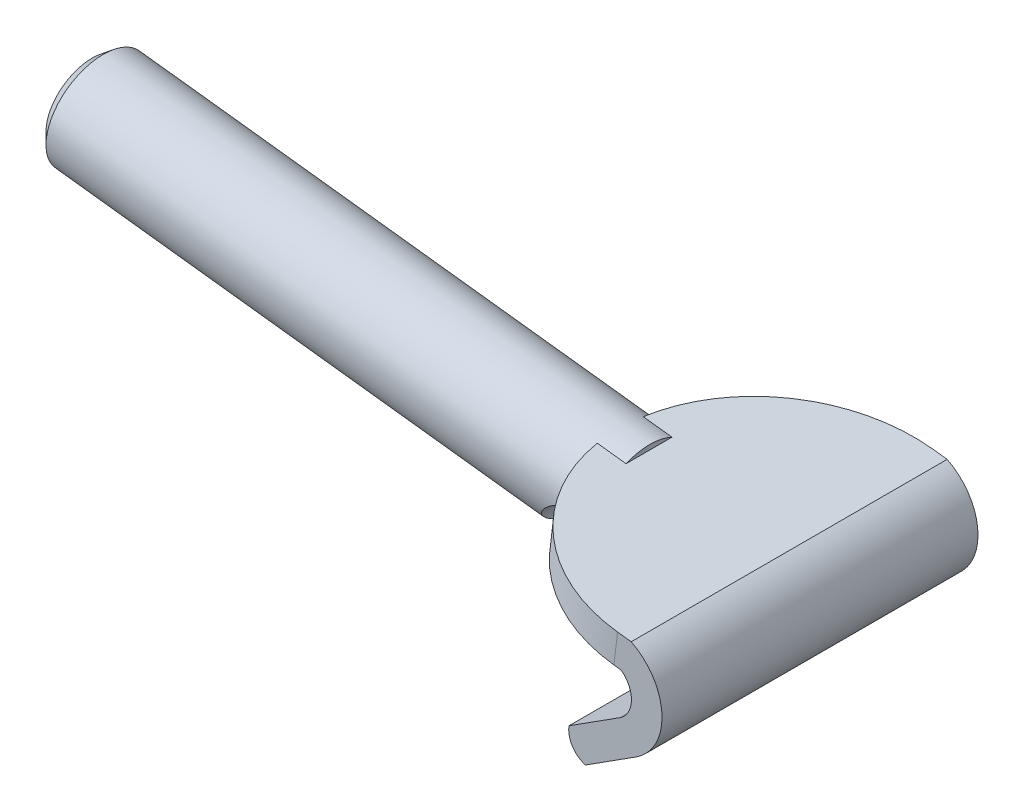
ISO-10303-21;
HEADER;
FILE_DESCRIPTION(('STEP AP214'),'2;1');
FILE_NAME('part.step','',(''),(''),'','','');
FILE_SCHEMA(('AUTOMOTIVE_DESIGN { 1 0 10303 214 1 1 1 1 }'));
ENDSEC;
DATA;
#1=APPLICATION_CONTEXT('core data for automotive mechanical design processes');
#2=APPLICATION_PROTOCOL_DEFINITION('international standard','automotive_design',2000,#1);
#3=PRODUCT_CONTEXT('',#1,'mechanical');
#4=PRODUCT('Part','Part','',(#3));
#5=PRODUCT_RELATED_PRODUCT_CATEGORY('part','',(#4));
#6=PRODUCT_DEFINITION_FORMATION('','',#4);
#7=PRODUCT_DEFINITION_CONTEXT('part definition',#1,'design');
#8=PRODUCT_DEFINITION('design','',#6,#7);
#9=PRODUCT_DEFINITION_SHAPE('','',#8);
#10=(LENGTH_UNIT() NAMED_UNIT(*) SI_UNIT(.MILLI.,.METRE.));
#11=(NAMED_UNIT(*) PLANE_ANGLE_UNIT() SI_UNIT($,.RADIAN.));
#12=(NAMED_UNIT(*) SI_UNIT($,.STERADIAN.) SOLID_ANGLE_UNIT());
#13=UNCERTAINTY_MEASURE_WITH_UNIT(LENGTH_MEASURE(1.E-05),#10,'distance_accuracy_value','');
#14=(GEOMETRIC_REPRESENTATION_CONTEXT(3) GLOBAL_UNCERTAINTY_ASSIGNED_CONTEXT((#13)) GLOBAL_UNIT_ASSIGNED_CONTEXT((#10,
#11,#12)) REPRESENTATION_CONTEXT('',''));
#15=CARTESIAN_POINT('',(0.,0.,0.));
#16=DIRECTION('',(0.,0.,1.));
#17=DIRECTION('',(1.,0.,0.));
#18=AXIS2_PLACEMENT_3D('',#15,#16,#17);
#19=CARTESIAN_POINT('',(13.8829714482748,-1.64423348901114,0.));
#20=DIRECTION('',(0.993059474125525,-0.117613268169611,0.));
#21=DIRECTION('',(0.117613268169611,0.993059474125525,0.));
#22=AXIS2_PLACEMENT_3D('',#19,#20,#21);
#23=CYLINDRICAL_SURFACE('',#22,2.5);
#24=CARTESIAN_POINT('',(13.8829714482748,-1.64423348901114,0.));
#25=DIRECTION('',(0.993059474125525,-0.117613268169611,0.));
#26=DIRECTION('',(0.117613268169611,0.993059474125525,0.));
#27=AXIS2_PLACEMENT_3D('',#24,#25,#26);
#28=CIRCLE('',#27,2.5);
#29=CARTESIAN_POINT('',(14.1453880985588,0.571463300886591,-1.12775229411898));
#30=VERTEX_POINT('',#29);
#31=CARTESIAN_POINT('',(14.1453880985588,0.571463300886591,1.12775229411898));
#32=VERTEX_POINT('',#31);
#33=EDGE_CURVE('E176',#30,#32,#28,.T.);
#34=ORIENTED_EDGE('',*,*,#33,.F.);
#35=DIRECTION('',(0.993059474125525,-0.117613268169611,0.));
#36=VECTOR('',#35,1.);
#37=CARTESIAN_POINT('',(14.1453880985588,0.571463300886591,-1.12775229411898));
#38=LINE('',#37,#36);
#39=CARTESIAN_POINT('',(12.7377186193522,0.738181017464317,-1.12775229411898));
#40=VERTEX_POINT('',#39);
#41=EDGE_CURVE('E41',#40,#30,#38,.T.);
#42=ORIENTED_EDGE('',*,*,#41,.F.);
#43=CARTESIAN_POINT('',(12.8547053786635,-0.786157891268378,-2.39068449266503));
#44=CARTESIAN_POINT('',(12.8560018632397,-0.718258201053487,-2.37001451135291));
#45=CARTESIAN_POINT('',(12.8563560480842,-0.651246299749109,-2.34651388027664));
#46=CARTESIAN_POINT('',(12.8553886602663,-0.519427945529631,-2.29405108067449));
#47=CARTESIAN_POINT('',(12.8540675431326,-0.454620898015424,-2.26509039860509));
#48=CARTESIAN_POINT('',(12.84790772878,-0.264195413286235,-2.17034763680059));
#49=CARTESIAN_POINT('',(12.8408739325724,-0.142465833166241,-2.0966721104767));
#50=CARTESIAN_POINT('',(12.8230510814303,0.0869389462101262,-1.930608832714));
#51=CARTESIAN_POINT('',(12.8122635085567,0.194619669181078,-1.83822847230187));
#52=CARTESIAN_POINT('',(12.7891884945399,0.393079993795638,-1.63714139083453));
#53=CARTESIAN_POINT('',(12.776903645221,0.483888133134881,-1.52846280931442));
#54=CARTESIAN_POINT('',(12.7602298489067,0.596943269286169,-1.36748757225684));
#55=CARTESIAN_POINT('',(12.7555593426848,0.627438231138076,-1.32084706820628));
#56=CARTESIAN_POINT('',(12.7464434319341,0.685224798834593,-1.22568485856089));
#57=CARTESIAN_POINT('',(12.741997742788,0.712520515719657,-1.17716567620583));
#58=CARTESIAN_POINT('',(12.7377186193522,0.738181017464323,-1.12775229411899));
#59=B_SPLINE_CURVE_WITH_KNOTS('',3,(#43,#44,#45,#46,#47,#48,#49,#50,#51,#52,#53,#54,#55,#56,#57,
#58),.UNSPECIFIED.,.F.,.F.,(4,2,2,2,2,2,2,4),(0.,0.212816557131109,0.425575260051398,
0.850761921579743,1.27578090161328,1.7000743421945,1.86773726122402,2.03518231430257),.UNSPECIFIED.);
#60=CARTESIAN_POINT('',(12.8547053786635,-0.786157891268378,-2.39068449266503));
#61=VERTEX_POINT('',#60);
#62=EDGE_CURVE('E11',#61,#40,#59,.T.);
#63=ORIENTED_EDGE('',*,*,#62,.F.);
#64=DIRECTION('',(0.993059474125525,-0.117613268169611,0.));
#65=VECTOR('',#64,1.);
#66=CARTESIAN_POINT('',(13.9689681963044,-0.918125910301697,-2.39068449266503));
#67=LINE('',#66,#65);
#68=CARTESIAN_POINT('',(13.9689681963044,-0.918125910301698,-2.39068449266503));
#69=VERTEX_POINT('',#68);
#70=EDGE_CURVE('E162',#69,#61,#67,.F.);
#71=ORIENTED_EDGE('',*,*,#70,.F.);
#72=CARTESIAN_POINT('',(13.9417780823596,-1.14770375194839,-2.44948974278318));
#73=VERTEX_POINT('',#72);
#74=EDGE_CURVE('E175',#73,#69,#28,.T.);
#75=ORIENTED_EDGE('',*,*,#74,.F.);
#76=CARTESIAN_POINT('',(13.9417780823596,-1.14770375194839,2.44948974278318));
#77=CARTESIAN_POINT('',(13.8584217241757,-1.13782171893328,2.44945479408885));
#78=CARTESIAN_POINT('',(13.7746547799585,-1.13145763845698,2.4502078798755));
#79=CARTESIAN_POINT('',(13.6069226022595,-1.12576554209242,2.4530353371811));
#80=CARTESIAN_POINT('',(13.5229574182983,-1.12643592361761,2.45510940765305));
#81=CARTESIAN_POINT('',(13.3553350423313,-1.13481231042977,2.4603266970929));
#82=CARTESIAN_POINT('',(13.2716782102875,-1.14252487202233,2.46347091065814));
#83=CARTESIAN_POINT('',(13.1053297113841,-1.16492890358102,2.47034370940225));
#84=CARTESIAN_POINT('',(13.0226380730892,-1.1796205795595,2.47407231182917));
#85=CARTESIAN_POINT('',(12.8587616713658,-1.21588909067311,2.48149278694208));
#86=CARTESIAN_POINT('',(12.7775770288394,-1.23746647572508,2.48518465667016));
#87=CARTESIAN_POINT('',(12.6172615713523,-1.2873559406721,2.49177299056692));
#88=CARTESIAN_POINT('',(12.5381316765451,-1.31567098203132,2.49466910375986));
#89=CARTESIAN_POINT('',(12.3048889197021,-1.41040236833186,2.50088497503735));
#90=CARTESIAN_POINT('',(12.1545233864567,-1.48669363587251,2.50175807687519));
#91=CARTESIAN_POINT('',(11.8979417426584,-1.64525935375929,2.49036813217002));
#92=CARTESIAN_POINT('',(11.7889423087966,-1.72321366540958,2.48072245680122));
#93=CARTESIAN_POINT('',(11.6348784027165,-1.84958525281812,2.45622219415932));
#94=CARTESIAN_POINT('',(11.5850917976231,-1.89328731510427,2.4463819946163));
#95=CARTESIAN_POINT('',(11.4889985896958,-1.98338449496106,2.42287108762303));
#96=CARTESIAN_POINT('',(11.4426904271877,-2.02977838882039,2.40920211009071));
#97=CARTESIAN_POINT('',(11.353518744827,-2.12508473868238,2.37747674074022));
#98=CARTESIAN_POINT('',(11.310685461692,-2.17401425308318,2.35938640769957));
#99=CARTESIAN_POINT('',(11.2291766176437,-2.27333160590924,2.31854450868327));
#100=CARTESIAN_POINT('',(11.1904990491018,-2.3237187250957,2.29579520903487));
#101=CARTESIAN_POINT('',(11.117474924204,-2.4251848790401,2.24541318385142));
#102=CARTESIAN_POINT('',(11.0831278574313,-2.47626383146735,2.21778103475959));
#103=CARTESIAN_POINT('',(11.0188405370135,-2.57825742894296,2.15758357060517));
#104=CARTESIAN_POINT('',(10.9888998403877,-2.62917209000379,2.12501875210199));
#105=CARTESIAN_POINT('',(10.9123475546149,-2.76818713279929,2.02847467721093));
#106=CARTESIAN_POINT('',(10.8702486745957,-2.85529518389684,1.95936038916393));
#107=CARTESIAN_POINT('',(10.7982731191629,-3.02212530790873,1.80736907366631));
#108=CARTESIAN_POINT('',(10.7683989733387,-3.10184584953379,1.72448920277103));
#109=CARTESIAN_POINT('',(10.7183031269495,-3.25177768405519,1.54558991513157));
#110=CARTESIAN_POINT('',(10.6982423461249,-3.32181774686445,1.44938263811162));
#111=CARTESIAN_POINT('',(10.6659457048714,-3.44836108514671,1.24725840276299));
#112=CARTESIAN_POINT('',(10.6537127412603,-3.50485934441124,1.14133786643547));
#113=CARTESIAN_POINT('',(10.6337186174156,-3.60755300006438,0.911062382742935));
#114=CARTESIAN_POINT('',(10.6265381726403,-3.65211809099759,0.785927916825172));
#115=CARTESIAN_POINT('',(10.616288692595,-3.72120024267072,0.530076207665856));
#116=CARTESIAN_POINT('',(10.6132206939643,-3.7457122479504,0.399357565366139));
#117=CARTESIAN_POINT('',(10.6096485381723,-3.77464220382498,0.128457378479982));
#118=CARTESIAN_POINT('',(10.6092928918002,-3.77789482397373,-0.0118521726050893));
#119=CARTESIAN_POINT('',(10.6113140001246,-3.76107014674392,-0.291065384965732));
#120=CARTESIAN_POINT('',(10.6136912129165,-3.74098893802695,-0.429968806601114));
#121=CARTESIAN_POINT('',(10.6225287389641,-3.67807979079745,-0.703135793898718));
#122=CARTESIAN_POINT('',(10.6290100898497,-3.63513483541924,-0.837371671433858));
#123=CARTESIAN_POINT('',(10.6488330052409,-3.52793929215113,-1.09666691942843));
#124=CARTESIAN_POINT('',(10.6621755075769,-3.46368579208588,-1.22172503273548));
#125=CARTESIAN_POINT('',(10.6899715121416,-3.35398087374144,-1.39847762276093));
#126=CARTESIAN_POINT('',(10.7004382362254,-3.31549354973028,-1.45524393137289));
#127=CARTESIAN_POINT('',(10.7244338388628,-3.23446932993293,-1.56510981462763));
#128=CARTESIAN_POINT('',(10.7379612350605,-3.19193440025721,-1.61821114811048));
#129=CARTESIAN_POINT('',(10.7685425431374,-3.10337882011834,-1.72026885100318));
#130=CARTESIAN_POINT('',(10.7855940152262,-3.05736059510745,-1.76922805521876));
#131=CARTESIAN_POINT('',(10.8236628285499,-2.96246675682126,-1.86262964172137));
#132=CARTESIAN_POINT('',(10.8446797113584,-2.91359147429,-1.90707254520815));
#133=CARTESIAN_POINT('',(10.8890171423839,-2.81808440401539,-1.98744528300446));
#134=CARTESIAN_POINT('',(10.9119795357133,-2.77162596228025,-2.02377918814868));
#135=CARTESIAN_POINT('',(10.9616949824883,-2.67759907549785,-2.09221203297846));
#136=CARTESIAN_POINT('',(10.988449276334,-2.63003027150088,-2.12430958021186));
#137=CARTESIAN_POINT('',(11.0458105963897,-2.5345258573034,-2.18413172864867));
#138=CARTESIAN_POINT('',(11.0764147190009,-2.48659054885246,-2.211859590396));
#139=CARTESIAN_POINT('',(11.1414678324163,-2.39101333482199,-2.2629897437171));
#140=CARTESIAN_POINT('',(11.1759182310491,-2.34337154345367,-2.28639044306694));
#141=CARTESIAN_POINT('',(11.2793380876007,-2.209130336502,-2.34699459932207));
#142=CARTESIAN_POINT('',(11.3528573877107,-2.12366477109428,-2.3791306446301));
#143=CARTESIAN_POINT('',(11.5112303322773,-1.95982070119749,-2.4306488567728));
#144=CARTESIAN_POINT('',(11.5960874397072,-1.8814443743307,-2.45002711616));
#145=CARTESIAN_POINT('',(11.7818397935085,-1.72899621085976,-2.47962098698385));
#146=CARTESIAN_POINT('',(11.8834531676586,-1.65565432205229,-2.48906594199242));
#147=CARTESIAN_POINT('',(12.0953562926277,-1.52209094005424,-2.49966776505942));
#148=CARTESIAN_POINT('',(12.2056522223086,-1.46187890760969,-2.50081867583783));
#149=CARTESIAN_POINT('',(12.4538028612,-1.34596152296962,-2.49794360796511));
#150=CARTESIAN_POINT('',(12.5929894468031,-1.29313365746805,-2.49292407666252));
#151=CARTESIAN_POINT('',(12.8776083377367,-1.208657186799,-2.48086926691112));
#152=CARTESIAN_POINT('',(13.023041394952,-1.17701113892268,-2.47383374521717));
#153=CARTESIAN_POINT('',(13.2337914769229,-1.14727782262078,-2.46500401369162));
#154=CARTESIAN_POINT('',(13.2979312255689,-1.14033249801008,-2.46249492285859));
#155=CARTESIAN_POINT('',(13.4265511766488,-1.13058689674302,-2.45801964828201));
#156=CARTESIAN_POINT('',(13.4910313482815,-1.12778625131724,-2.4560534162507));
#157=CARTESIAN_POINT('',(13.6200300733726,-1.12635013067022,-2.45284205944885));
#158=CARTESIAN_POINT('',(13.6845486043706,-1.12771314232338,-2.4515966729096));
#159=CARTESIAN_POINT('',(13.8133849818209,-1.1345936625471,-2.44991441076609));
#160=CARTESIAN_POINT('',(13.8777027926631,-1.14011187042087,-2.44947767129675));
#161=CARTESIAN_POINT('',(13.9417780823596,-1.14770375194839,-2.44948974278318));
#162=B_SPLINE_CURVE_WITH_KNOTS('',3,(#76,#77,#78,#79,#80,#81,#82,#83,#84,#85,#86,#87,#88,#89,
#90,#91,#92,#93,#94,#95,#96,#97,#98,#99,#100,#101,#102,#103,#104,#105,#106,#107,#108,#109,#110,
#111,#112,#113,#114,#115,#116,#117,#118,#119,#120,#121,#122,#123,#124,#125,#126,#127,#128,#129,
#130,#131,#132,#133,#134,#135,#136,#137,#138,#139,#140,#141,#142,#143,#144,#145,#146,#147,#148,
#149,#150,#151,#152,#153,#154,#155,#156,#157,#158,#159,#160,#161),.UNSPECIFIED.,.F.,.F.,(4,2,2,
2,2,2,2,2,2,2,2,2,2,2,2,2,2,2,2,2,2,2,2,2,2,2,2,2,2,2,2,2,2,2,2,2,2,2,2,2,2,2,4),(0.,
0.251733071114698,0.503408793810469,0.755319067064781,1.00723677677169,1.25917461054625,
1.51122338609625,2.01410593111071,2.41542605822435,2.6161262997818,2.8167360068498,
3.01893696253835,3.22103979138412,3.42311877696523,3.62517743326618,3.98001869749819,
4.33493334977387,4.69548757576925,5.05617515399081,5.45351401957459,5.85095302497722,
6.27000702016666,6.6891312695127,7.110421517639,7.53176936599278,7.73967165982798,
7.94747347638681,8.15513190652381,8.36276634474005,8.55238332960878,8.74206248545298,
8.93159943064551,9.12120597972917,9.47119238808851,9.82128594028005,10.1968930000714,
10.5727698165173,11.0179448570834,11.463173634159,11.6567584921778,11.8503261251078,
12.0438234214832,12.237353289974),.UNSPECIFIED.);
#163=CARTESIAN_POINT('',(13.9417780823596,-1.14770375194839,2.44948974278318));
#164=VERTEX_POINT('',#163);
#165=EDGE_CURVE('E167',#164,#73,#162,.T.);
#166=ORIENTED_EDGE('',*,*,#165,.F.);
#167=CARTESIAN_POINT('',(13.9689681963044,-0.918125910301698,2.39068449266503));
#168=VERTEX_POINT('',#167);
#169=EDGE_CURVE('E201',#168,#164,#28,.T.);
#170=ORIENTED_EDGE('',*,*,#169,.F.);
#171=DIRECTION('',(0.993059474125525,-0.117613268169611,0.));
#172=VECTOR('',#171,1.);
#173=CARTESIAN_POINT('',(13.9689681963044,-0.918125910301697,2.39068449266503));
#174=LINE('',#173,#172);
#175=CARTESIAN_POINT('',(12.8547053786635,-0.786157891268378,2.39068449266503));
#176=VERTEX_POINT('',#175);
#177=EDGE_CURVE('E164',#176,#168,#174,.T.);
#178=ORIENTED_EDGE('',*,*,#177,.F.);
#179=CARTESIAN_POINT('',(12.7377186193522,0.738181017464318,1.12775229411899));
#180=CARTESIAN_POINT('',(12.743214031692,0.705215634422802,1.19123623103898));
#181=CARTESIAN_POINT('',(12.7489881037883,0.669545154426442,1.25324515400718));
#182=CARTESIAN_POINT('',(12.7608394938206,0.593068768534637,1.37396840052659));
#183=CARTESIAN_POINT('',(12.7669167667775,0.552263622996651,1.43268321002302));
#184=CARTESIAN_POINT('',(12.7852320496641,0.422492433164942,1.60346301787201));
#185=CARTESIAN_POINT('',(12.7975465986189,0.326209290829375,1.71008936927809));
#186=CARTESIAN_POINT('',(12.8200748018476,0.1171392033756,1.90586260416768));
#187=CARTESIAN_POINT('',(12.8302879454177,0.00434825774315125,1.99500523834448));
#188=CARTESIAN_POINT('',(12.8462758248661,-0.234534331205059,2.15331426401024));
#189=CARTESIAN_POINT('',(12.8520610811865,-0.36059363305083,2.22252776030541));
#190=CARTESIAN_POINT('',(12.8555484234282,-0.539390226499961,2.30206319590904));
#191=CARTESIAN_POINT('',(12.8560493431568,-0.587998357276925,2.32191993659898));
#192=CARTESIAN_POINT('',(12.8561048858744,-0.686295520147208,2.3585909608853));
#193=CARTESIAN_POINT('',(12.8556604266086,-0.735983457646978,2.37540817796309));
#194=CARTESIAN_POINT('',(12.8547053786635,-0.786157891268377,2.39068449266503));
#195=B_SPLINE_CURVE_WITH_KNOTS('',3,(#179,#180,#181,#182,#183,#184,#185,#186,#187,#188,#189,
#190,#191,#192,#193,#194),.UNSPECIFIED.,.F.,.F.,(4,2,2,2,2,2,2,4),(0.,0.21508581075014,
0.43013980831517,0.860495977273426,1.29095661231119,1.72039129159653,1.87783750929436,
2.03513095273173),.UNSPECIFIED.);
#196=CARTESIAN_POINT('',(12.7377186193522,0.738181017464317,1.12775229411898));
#197=VERTEX_POINT('',#196);
#198=EDGE_CURVE('E31',#197,#176,#195,.T.);
#199=ORIENTED_EDGE('',*,*,#198,.F.);
#200=DIRECTION('',(0.993059474125525,-0.117613268169611,0.));
#201=VECTOR('',#200,1.);
#202=CARTESIAN_POINT('',(14.1453880985588,0.571463300886591,1.12775229411898));
#203=LINE('',#202,#201);
#204=EDGE_CURVE('E158',#32,#197,#203,.F.);
#205=ORIENTED_EDGE('',*,*,#204,.F.);
#206=EDGE_LOOP('',(#34,#42,#63,#71,#75,#166,#170,#178,#199,#205));
#207=FACE_BOUND('',#206,.T.);
#208=CARTESIAN_POINT('',(-12.919207228636,1.53008981225256,0.));
#209=DIRECTION('',(0.993059474125525,-0.117613268169611,0.));
#210=DIRECTION('',(0.117613268169611,0.993059474125525,0.));
#211=AXIS2_PLACEMENT_3D('',#208,#209,#210);
#212=CIRCLE('',#211,2.5);
#213=CARTESIAN_POINT('',(-12.625174058212,4.01273849756637,0.));
#214=VERTEX_POINT('',#213);
#215=EDGE_CURVE('E374',#214,#214,#212,.T.);
#216=ORIENTED_EDGE('',*,*,#215,.T.);
#217=EDGE_LOOP('',(#216));
#218=FACE_BOUND('',#217,.T.);
#219=ADVANCED_FACE('F17',(#207,#218),#23,.T.);
#220=CARTESIAN_POINT('',(14.1770046186989,0.838415196302671,0.));
#221=DIRECTION('',(-0.993059474125525,0.117613268169611,0.));
#222=DIRECTION('',(-0.117613268169611,-0.993059474125525,0.));
#223=AXIS2_PLACEMENT_3D('',#220,#221,#222);
#224=PLANE('',#223);
#225=DIRECTION('',(0.,0.,-1.));
#226=VECTOR('',#225,1.);
#227=CARTESIAN_POINT('',(13.9689681963044,-0.918125910301698,0.));
#228=LINE('',#227,#226);
#229=EDGE_CURVE('E199',#168,#69,#228,.T.);
#230=ORIENTED_EDGE('',*,*,#229,.F.);
#231=ORIENTED_EDGE('',*,*,#169,.T.);
#232=DIRECTION('',(0.,0.,-1.));
#233=VECTOR('',#232,1.);
#234=CARTESIAN_POINT('',(13.9417780823596,-1.14770375194839,5.));
#235=LINE('',#234,#233);
#236=EDGE_CURVE('E373',#73,#164,#235,.F.);
#237=ORIENTED_EDGE('',*,*,#236,.F.);
#238=ORIENTED_EDGE('',*,*,#74,.T.);
#239=EDGE_LOOP('',(#230,#231,#237,#238));
#240=FACE_BOUND('',#239,.T.);
#241=ADVANCED_FACE('F188',(#240),#224,.F.);
#242=DIRECTION('',(0.,0.,1.));
#243=VECTOR('',#242,1.);
#244=CARTESIAN_POINT('',(14.1453880985588,0.571463300886591,0.));
#245=LINE('',#244,#243);
#246=EDGE_CURVE('E205',#30,#32,#245,.T.);
#247=ORIENTED_EDGE('',*,*,#246,.F.);
#248=ORIENTED_EDGE('',*,*,#33,.T.);
#249=EDGE_LOOP('',(#247,#248));
#250=FACE_BOUND('',#249,.T.);
#251=ADVANCED_FACE('F190',(#250),#224,.F.);
#252=CARTESIAN_POINT('',(-13.4063029006946,1.58777912028975,0.));
#253=DIRECTION('',(0.993059474125525,-0.117613268169611,0.));
#254=DIRECTION('',(0.117613268169611,0.993059474125525,0.));
#255=AXIS2_PLACEMENT_3D('',#252,#253,#254);
#256=PLANE('',#255);
#257=CARTESIAN_POINT('',(-13.4063029006946,1.58777912028975,0.));
#258=DIRECTION('',(0.993059474125525,-0.117613268169611,0.));
#259=DIRECTION('',(0.117613268169611,0.993059474125525,0.));
#260=AXIS2_PLACEMENT_3D('',#257,#258,#259);
#261=CIRCLE('',#260,2.0095);
#262=CARTESIAN_POINT('',(-13.1699590383078,3.583332133545,0.));
#263=VERTEX_POINT('',#262);
#264=EDGE_CURVE('E371',#263,#263,#261,.T.);
#265=ORIENTED_EDGE('',*,*,#264,.F.);
#266=EDGE_LOOP('',(#265));
#267=FACE_BOUND('',#266,.T.);
#268=ADVANCED_FACE('F19',(#267),#256,.F.);
#269=CARTESIAN_POINT('',(-13.4063029006946,1.58777912028975,0.));
#270=DIRECTION('',(0.993059474125525,-0.117613268169611,0.));
#271=DIRECTION('',(0.117613268169611,0.993059474125525,0.));
#272=AXIS2_PLACEMENT_3D('',#269,#270,#271);
#273=CONICAL_SURFACE('',#272,2.0095,0.785398163397454);
#274=ORIENTED_EDGE('',*,*,#215,.F.);
#275=EDGE_LOOP('',(#274));
#276=FACE_BOUND('',#275,.T.);
#277=ORIENTED_EDGE('',*,*,#264,.T.);
#278=EDGE_LOOP('',(#277));
#279=FACE_BOUND('',#278,.T.);
#280=ADVANCED_FACE('F185',(#276,#279),#273,.T.);
#281=CARTESIAN_POINT('',(13.5889382778508,-4.12688217432496,5.));
#282=DIRECTION('',(0.,0.,-1.));
#283=DIRECTION('',(-1.,0.,0.));
#284=AXIS2_PLACEMENT_3D('',#281,#282,#283);
#285=CYLINDRICAL_SURFACE('',#284,3.);
#286=ORIENTED_EDGE('',*,*,#165,.T.);
#287=ORIENTED_EDGE('',*,*,#236,.T.);
#288=EDGE_LOOP('',(#286,#287));
#289=FACE_BOUND('',#288,.T.);
#290=ADVANCED_FACE('F180',(#289),#285,.F.);
#291=CARTESIAN_POINT('',(20.3520098118433,-0.163619625173478,0.));
#292=DIRECTION('',(0.117613268169612,0.993059474125525,0.));
#293=DIRECTION('',(-0.993059474125525,0.117613268169612,0.));
#294=AXIS2_PLACEMENT_3D('',#291,#292,#293);
#295=CYLINDRICAL_SURFACE('',#294,7.75000000000001);
#296=CARTESIAN_POINT('',(20.1755899095889,-1.65320883636178,0.));
#297=DIRECTION('',(0.117613268169612,0.993059474125525,0.));
#298=DIRECTION('',(-0.993059474125525,0.117613268169612,0.));
#299=AXIS2_PLACEMENT_3D('',#296,#297,#298);
#300=CIRCLE('',#299,7.75000000000001);
#301=CARTESIAN_POINT('',(20.1755899095889,-1.65320883636176,-7.75));
#302=VERTEX_POINT('',#301);
#303=EDGE_CURVE('E155',#302,#61,#300,.T.);
#304=ORIENTED_EDGE('',*,*,#303,.T.);
#305=ORIENTED_EDGE('',*,*,#62,.T.);
#306=CARTESIAN_POINT('',(20.3520098118433,-0.163619625173488,0.));
#307=DIRECTION('',(0.117613268169612,0.993059474125525,0.));
#308=DIRECTION('',(-0.993059474125525,0.117613268169612,0.));
#309=AXIS2_PLACEMENT_3D('',#306,#307,#308);
#310=CIRCLE('',#309,7.75000000000001);
#311=CARTESIAN_POINT('',(20.3520098118433,-0.163619625173477,-7.75));
#312=VERTEX_POINT('',#311);
#313=EDGE_CURVE('E151',#312,#40,#310,.T.);
#314=ORIENTED_EDGE('',*,*,#313,.F.);
#315=DIRECTION('',(0.117613268169612,0.993059474125525,0.));
#316=VECTOR('',#315,1.);
#317=CARTESIAN_POINT('',(20.1755899095889,-1.65320883636178,-7.75000000000001));
#318=LINE('',#317,#316);
#319=EDGE_CURVE('E142',#302,#312,#318,.T.);
#320=ORIENTED_EDGE('',*,*,#319,.F.);
#321=EDGE_LOOP('',(#304,#305,#314,#320));
#322=FACE_BOUND('',#321,.T.);
#323=ADVANCED_FACE('F184',(#322),#295,.T.);
#324=CARTESIAN_POINT('',(20.3520098118433,-0.163619625173487,7.75));
#325=VERTEX_POINT('',#324);
#326=EDGE_CURVE('E150',#197,#325,#310,.T.);
#327=ORIENTED_EDGE('',*,*,#326,.F.);
#328=ORIENTED_EDGE('',*,*,#198,.T.);
#329=CARTESIAN_POINT('',(20.1755899095889,-1.65320883636176,7.75));
#330=VERTEX_POINT('',#329);
#331=EDGE_CURVE('E154',#176,#330,#300,.T.);
#332=ORIENTED_EDGE('',*,*,#331,.T.);
#333=DIRECTION('',(0.117613268169612,0.993059474125524,0.));
#334=VECTOR('',#333,1.);
#335=CARTESIAN_POINT('',(20.1755899095889,-1.65320883636177,7.75000000000001));
#336=LINE('',#335,#334);
#337=EDGE_CURVE('E139',#330,#325,#336,.T.);
#338=ORIENTED_EDGE('',*,*,#337,.T.);
#339=EDGE_LOOP('',(#327,#328,#332,#338));
#340=FACE_BOUND('',#339,.T.);
#341=ADVANCED_FACE('F218',(#340),#295,.T.);
#342=CARTESIAN_POINT('',(20.1755899095889,-1.65320883636177,0.));
#343=DIRECTION('',(0.117613268169612,0.993059474125525,0.));
#344=DIRECTION('',(-0.993059474125525,0.117613268169612,0.));
#345=AXIS2_PLACEMENT_3D('',#342,#343,#344);
#346=PLANE('',#345);
#347=ORIENTED_EDGE('',*,*,#303,.F.);
#348=DIRECTION('',(0.993059474125525,-0.117613268169609,0.));
#349=VECTOR('',#348,1.);
#350=CARTESIAN_POINT('',(20.1755899095889,-1.65320883636176,-7.75));
#351=LINE('',#350,#349);
#352=CARTESIAN_POINT('',(20.5297303465721,-1.69515155507082,-7.75));
#353=VERTEX_POINT('',#352);
#354=EDGE_CURVE('E386',#302,#353,#351,.T.);
#355=ORIENTED_EDGE('',*,*,#354,.T.);
#356=DIRECTION('',(0.,0.,-1.));
#357=VECTOR('',#356,1.);
#358=CARTESIAN_POINT('',(20.5297303465721,-1.69515155507082,7.75));
#359=LINE('',#358,#357);
#360=CARTESIAN_POINT('',(20.5297303465721,-1.69515155507082,7.75));
#361=VERTEX_POINT('',#360);
#362=EDGE_CURVE('E388',#361,#353,#359,.T.);
#363=ORIENTED_EDGE('',*,*,#362,.F.);
#364=DIRECTION('',(0.993059474125525,-0.117613268169609,0.));
#365=VECTOR('',#364,1.);
#366=CARTESIAN_POINT('',(20.1755899095889,-1.65320883636176,7.75));
#367=LINE('',#366,#365);
#368=EDGE_CURVE('E215',#330,#361,#367,.T.);
#369=ORIENTED_EDGE('',*,*,#368,.F.);
#370=ORIENTED_EDGE('',*,*,#331,.F.);
#371=ORIENTED_EDGE('',*,*,#177,.T.);
#372=ORIENTED_EDGE('',*,*,#229,.T.);
#373=ORIENTED_EDGE('',*,*,#70,.T.);
#374=EDGE_LOOP('',(#347,#355,#363,#369,#370,#371,#372,#373));
#375=FACE_BOUND('',#374,.T.);
#376=ADVANCED_FACE('F187',(#375),#346,.F.);
#377=CARTESIAN_POINT('',(20.3520098118433,-0.163619625173483,-7.75));
#378=DIRECTION('',(-0.117613268169612,-0.993059474125525,0.));
#379=DIRECTION('',(0.993059474125525,-0.117613268169612,0.));
#380=AXIS2_PLACEMENT_3D('',#377,#378,#379);
#381=PLANE('',#380);
#382=ORIENTED_EDGE('',*,*,#313,.T.);
#383=ORIENTED_EDGE('',*,*,#41,.T.);
#384=ORIENTED_EDGE('',*,*,#246,.T.);
#385=ORIENTED_EDGE('',*,*,#204,.T.);
#386=ORIENTED_EDGE('',*,*,#326,.T.);
#387=DIRECTION('',(-0.993059474125525,0.11761326816961,0.));
#388=VECTOR('',#387,1.);
#389=CARTESIAN_POINT('',(21.0224477019451,-0.24302311853327,7.75));
#390=LINE('',#389,#388);
#391=CARTESIAN_POINT('',(21.0224477019451,-0.24302311853327,7.75));
#392=VERTEX_POINT('',#391);
#393=EDGE_CURVE('E415',#392,#325,#390,.T.);
#394=ORIENTED_EDGE('',*,*,#393,.F.);
#395=DIRECTION('',(0.,0.,-1.));
#396=VECTOR('',#395,1.);
#397=CARTESIAN_POINT('',(21.0224477019451,-0.24302311853327,7.75));
#398=LINE('',#397,#396);
#399=CARTESIAN_POINT('',(21.0224477019451,-0.24302311853327,-7.75));
#400=VERTEX_POINT('',#399);
#401=EDGE_CURVE('E397',#392,#400,#398,.T.);
#402=ORIENTED_EDGE('',*,*,#401,.T.);
#403=DIRECTION('',(-0.993059474125525,0.11761326816961,0.));
#404=VECTOR('',#403,1.);
#405=CARTESIAN_POINT('',(21.0224477019451,-0.24302311853327,-7.75));
#406=LINE('',#405,#404);
#407=EDGE_CURVE('E383',#400,#312,#406,.T.);
#408=ORIENTED_EDGE('',*,*,#407,.T.);
#409=EDGE_LOOP('',(#382,#383,#384,#385,#386,#394,#402,#408));
#410=FACE_BOUND('',#409,.T.);
#411=ADVANCED_FACE('F230',(#410),#381,.F.);
#412=CARTESIAN_POINT('',(20.4563926917879,-3.75228724862209,7.75));
#413=DIRECTION('',(0.537799403885264,-0.843072832666701,0.));
#414=DIRECTION('',(0.843072832666701,0.537799403885264,0.));
#415=AXIS2_PLACEMENT_3D('',#412,#413,#414);
#416=PLANE('',#415);
#417=DIRECTION('',(-0.843072832666701,-0.537799403885264,0.));
#418=VECTOR('',#417,1.);
#419=CARTESIAN_POINT('',(20.4563926917879,-3.75228724862209,-7.75));
#420=LINE('',#419,#418);
#421=CARTESIAN_POINT('',(20.4563926917879,-3.75228724862209,-7.75));
#422=VERTEX_POINT('',#421);
#423=CARTESIAN_POINT('',(17.9687122494882,-5.33918817471884,-7.75));
#424=VERTEX_POINT('',#423);
#425=EDGE_CURVE('E138',#422,#424,#420,.T.);
#426=ORIENTED_EDGE('',*,*,#425,.T.);
#427=DIRECTION('',(0.,0.,-1.));
#428=VECTOR('',#427,1.);
#429=CARTESIAN_POINT('',(17.9687122494882,-5.33918817471884,7.75));
#430=LINE('',#429,#428);
#431=CARTESIAN_POINT('',(17.9687122494882,-5.33918817471884,7.75));
#432=VERTEX_POINT('',#431);
#433=EDGE_CURVE('E119',#432,#424,#430,.T.);
#434=ORIENTED_EDGE('',*,*,#433,.F.);
#435=DIRECTION('',(-0.843072832666701,-0.537799403885264,0.));
#436=VECTOR('',#435,1.);
#437=CARTESIAN_POINT('',(20.4563926917879,-3.75228724862209,7.75));
#438=LINE('',#437,#436);
#439=CARTESIAN_POINT('',(20.4563926917879,-3.75228724862209,7.75));
#440=VERTEX_POINT('',#439);
#441=EDGE_CURVE('E126',#440,#432,#438,.T.);
#442=ORIENTED_EDGE('',*,*,#441,.F.);
#443=DIRECTION('',(0.,0.,-1.));
#444=VECTOR('',#443,1.);
#445=CARTESIAN_POINT('',(20.4563926917879,-3.75228724862209,7.75));
#446=LINE('',#445,#444);
#447=EDGE_CURVE('E394',#440,#422,#446,.T.);
#448=ORIENTED_EDGE('',*,*,#447,.T.);
#449=EDGE_LOOP('',(#426,#434,#442,#448));
#450=FACE_BOUND('',#449,.T.);
#451=ADVANCED_FACE('F136',(#450),#416,.F.);
#452=CARTESIAN_POINT('',(19.0958780046596,-5.50976765874052,7.75));
#453=DIRECTION('',(0.,0.,-1.));
#454=DIRECTION('',(-1.,0.,0.));
#455=AXIS2_PLACEMENT_3D('',#452,#453,#454);
#456=CYLINDRICAL_SURFACE('',#455,1.14000000000001);
#457=CARTESIAN_POINT('',(19.0958780046596,-5.50976765874052,-7.75));
#458=DIRECTION('',(0.,0.,1.));
#459=DIRECTION('',(1.,0.,0.));
#460=AXIS2_PLACEMENT_3D('',#457,#458,#459);
#461=CIRCLE('',#460,1.14000000000001);
#462=CARTESIAN_POINT('',(18.7754113553161,-6.60379742371889,-7.75));
#463=VERTEX_POINT('',#462);
#464=EDGE_CURVE('E408',#424,#463,#461,.T.);
#465=ORIENTED_EDGE('',*,*,#464,.T.);
#466=DIRECTION('',(0.,0.,-1.));
#467=VECTOR('',#466,1.);
#468=CARTESIAN_POINT('',(18.7754113553161,-6.60379742371889,7.75));
#469=LINE('',#468,#467);
#470=CARTESIAN_POINT('',(18.7754113553161,-6.60379742371889,7.75));
#471=VERTEX_POINT('',#470);
#472=EDGE_CURVE('E122',#471,#463,#469,.T.);
#473=ORIENTED_EDGE('',*,*,#472,.F.);
#474=CARTESIAN_POINT('',(19.0958780046596,-5.50976765874052,7.75));
#475=DIRECTION('',(0.,0.,1.));
#476=DIRECTION('',(1.,0.,0.));
#477=AXIS2_PLACEMENT_3D('',#474,#475,#476);
#478=CIRCLE('',#477,1.14000000000001);
#479=EDGE_CURVE('E115',#432,#471,#478,.T.);
#480=ORIENTED_EDGE('',*,*,#479,.F.);
#481=ORIENTED_EDGE('',*,*,#433,.T.);
#482=EDGE_LOOP('',(#465,#473,#480,#481));
#483=FACE_BOUND('',#482,.T.);
#484=ADVANCED_FACE('F117',(#483),#456,.T.);
#485=CARTESIAN_POINT('',(18.7754113553161,-6.60379742371889,7.75));
#486=DIRECTION('',(-0.537799403885263,0.843072832666701,0.));
#487=DIRECTION('',(-0.843072832666701,-0.537799403885263,0.));
#488=AXIS2_PLACEMENT_3D('',#485,#486,#487);
#489=PLANE('',#488);
#490=DIRECTION('',(0.843072832666701,0.537799403885263,0.));
#491=VECTOR('',#490,1.);
#492=CARTESIAN_POINT('',(18.7754113553161,-6.60379742371889,-7.75));
#493=LINE('',#492,#491);
#494=CARTESIAN_POINT('',(21.2630917976158,-5.01689649762214,-7.75));
#495=VERTEX_POINT('',#494);
#496=EDGE_CURVE('E406',#463,#495,#493,.T.);
#497=ORIENTED_EDGE('',*,*,#496,.T.);
#498=DIRECTION('',(0.,0.,-1.));
#499=VECTOR('',#498,1.);
#500=CARTESIAN_POINT('',(21.2630917976158,-5.01689649762214,7.75));
#501=LINE('',#500,#499);
#502=CARTESIAN_POINT('',(21.2630917976158,-5.01689649762214,7.75));
#503=VERTEX_POINT('',#502);
#504=EDGE_CURVE('E144',#503,#495,#501,.T.);
#505=ORIENTED_EDGE('',*,*,#504,.F.);
#506=DIRECTION('',(0.843072832666701,0.537799403885263,0.));
#507=VECTOR('',#506,1.);
#508=CARTESIAN_POINT('',(18.7754113553161,-6.60379742371889,7.75));
#509=LINE('',#508,#507);
#510=EDGE_CURVE('E125',#471,#503,#509,.T.);
#511=ORIENTED_EDGE('',*,*,#510,.F.);
#512=ORIENTED_EDGE('',*,*,#472,.T.);
#513=EDGE_LOOP('',(#497,#505,#511,#512));
#514=FACE_BOUND('',#513,.T.);
#515=ADVANCED_FACE('F239',(#514),#489,.F.);
#516=CARTESIAN_POINT('',(19.7841434369313,-2.69844620778871,7.75));
#517=DIRECTION('',(0.,0.,-1.));
#518=DIRECTION('',(-1.,0.,0.));
#519=AXIS2_PLACEMENT_3D('',#516,#517,#518);
#520=CYLINDRICAL_SURFACE('',#519,2.75);
#521=CARTESIAN_POINT('',(19.7841434369313,-2.69844620778871,-7.75));
#522=DIRECTION('',(0.,0.,1.));
#523=DIRECTION('',(1.,0.,0.));
#524=AXIS2_PLACEMENT_3D('',#521,#522,#523);
#525=CIRCLE('',#524,2.75);
#526=EDGE_CURVE('E403',#495,#400,#525,.T.);
#527=ORIENTED_EDGE('',*,*,#526,.T.);
#528=ORIENTED_EDGE('',*,*,#401,.F.);
#529=CARTESIAN_POINT('',(19.7841434369313,-2.69844620778871,7.75));
#530=DIRECTION('',(0.,0.,1.));
#531=DIRECTION('',(1.,0.,0.));
#532=AXIS2_PLACEMENT_3D('',#529,#530,#531);
#533=CIRCLE('',#532,2.75);
#534=EDGE_CURVE('E404',#503,#392,#533,.T.);
#535=ORIENTED_EDGE('',*,*,#534,.F.);
#536=ORIENTED_EDGE('',*,*,#504,.T.);
#537=EDGE_LOOP('',(#527,#528,#535,#536));
#538=FACE_BOUND('',#537,.T.);
#539=ADVANCED_FACE('F242',(#538),#520,.T.);
#540=CARTESIAN_POINT('',(19.7841434369313,-2.69844620778871,7.75));
#541=DIRECTION('',(0.,0.,-1.));
#542=DIRECTION('',(-1.,0.,0.));
#543=AXIS2_PLACEMENT_3D('',#540,#541,#542);
#544=CYLINDRICAL_SURFACE('',#543,1.25);
#545=CARTESIAN_POINT('',(19.7841434369313,-2.69844620778871,-7.75));
#546=DIRECTION('',(0.,0.,1.));
#547=DIRECTION('',(1.,0.,0.));
#548=AXIS2_PLACEMENT_3D('',#545,#546,#547);
#549=CIRCLE('',#548,1.25);
#550=EDGE_CURVE('E134',#422,#353,#549,.T.);
#551=ORIENTED_EDGE('',*,*,#550,.F.);
#552=ORIENTED_EDGE('',*,*,#447,.F.);
#553=CARTESIAN_POINT('',(19.7841434369313,-2.69844620778871,7.75));
#554=DIRECTION('',(0.,0.,1.));
#555=DIRECTION('',(1.,0.,0.));
#556=AXIS2_PLACEMENT_3D('',#553,#554,#555);
#557=CIRCLE('',#556,1.25);
#558=EDGE_CURVE('E132',#440,#361,#557,.T.);
#559=ORIENTED_EDGE('',*,*,#558,.T.);
#560=ORIENTED_EDGE('',*,*,#362,.T.);
#561=EDGE_LOOP('',(#551,#552,#559,#560));
#562=FACE_BOUND('',#561,.T.);
#563=ADVANCED_FACE('F246',(#562),#544,.F.);
#564=CARTESIAN_POINT('',(19.0958780046596,-5.50976765874052,7.75));
#565=DIRECTION('',(0.,0.,1.));
#566=DIRECTION('',(1.,0.,0.));
#567=AXIS2_PLACEMENT_3D('',#564,#565,#566);
#568=PLANE('',#567);
#569=ORIENTED_EDGE('',*,*,#441,.T.);
#570=ORIENTED_EDGE('',*,*,#479,.T.);
#571=ORIENTED_EDGE('',*,*,#510,.T.);
#572=ORIENTED_EDGE('',*,*,#534,.T.);
#573=ORIENTED_EDGE('',*,*,#393,.T.);
#574=ORIENTED_EDGE('',*,*,#337,.F.);
#575=ORIENTED_EDGE('',*,*,#368,.T.);
#576=ORIENTED_EDGE('',*,*,#558,.F.);
#577=EDGE_LOOP('',(#569,#570,#571,#572,#573,#574,#575,#576));
#578=FACE_BOUND('',#577,.T.);
#579=ADVANCED_FACE('F130',(#578),#568,.T.);
#580=CARTESIAN_POINT('',(19.0958780046596,-5.50976765874052,-7.75));
#581=DIRECTION('',(0.,0.,1.));
#582=DIRECTION('',(1.,0.,0.));
#583=AXIS2_PLACEMENT_3D('',#580,#581,#582);
#584=PLANE('',#583);
#585=ORIENTED_EDGE('',*,*,#425,.F.);
#586=ORIENTED_EDGE('',*,*,#550,.T.);
#587=ORIENTED_EDGE('',*,*,#354,.F.);
#588=ORIENTED_EDGE('',*,*,#319,.T.);
#589=ORIENTED_EDGE('',*,*,#407,.F.);
#590=ORIENTED_EDGE('',*,*,#526,.F.);
#591=ORIENTED_EDGE('',*,*,#496,.F.);
#592=ORIENTED_EDGE('',*,*,#464,.F.);
#593=EDGE_LOOP('',(#585,#586,#587,#588,#589,#590,#591,#592));
#594=FACE_BOUND('',#593,.T.);
#595=ADVANCED_FACE('F251',(#594),#584,.F.);
#596=CLOSED_SHELL('',(#219,#241,#251,#268,#280,#290,#323,#341,#376,#411,#451,#484,#515,#539,
#563,#579,#595));
#597=MANIFOLD_SOLID_BREP('B1',#596);
#598=ADVANCED_BREP_SHAPE_REPRESENTATION('',(#18,#597),#14);
#599=SHAPE_DEFINITION_REPRESENTATION(#9,#598);
ENDSEC;
END-ISO-10303-21;
